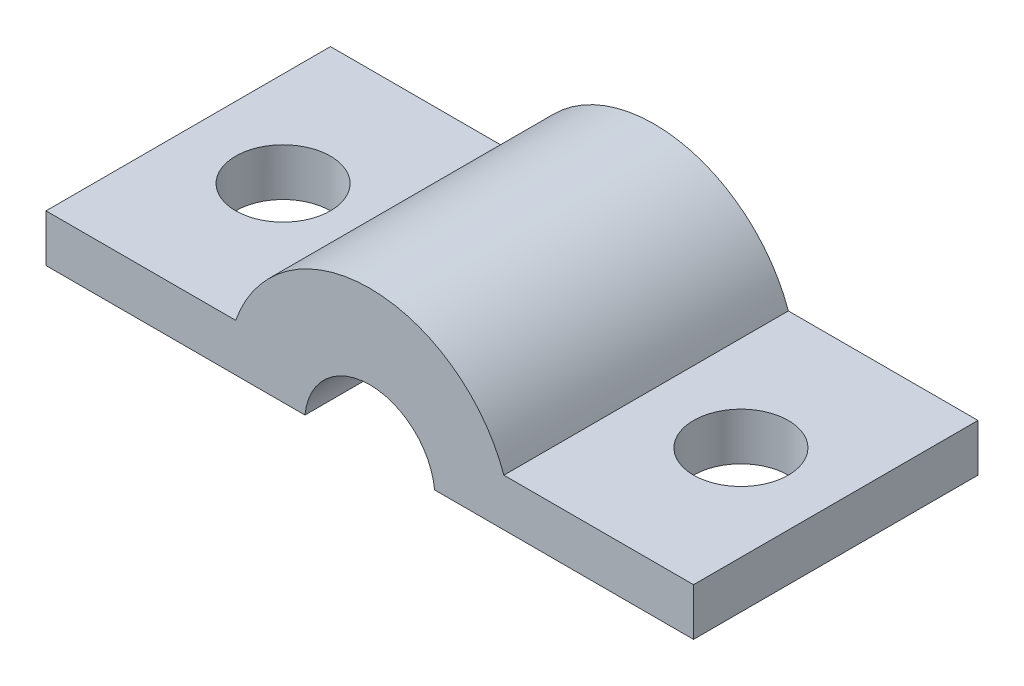
ISO-10303-21;
HEADER;
FILE_DESCRIPTION(('STEP AP214'),'2;1');
FILE_NAME('part.step','',(''),(''),'','','');
FILE_SCHEMA(('AUTOMOTIVE_DESIGN { 1 0 10303 214 1 1 1 1 }'));
ENDSEC;
DATA;
#1=APPLICATION_CONTEXT('core data for automotive mechanical design processes');
#2=APPLICATION_PROTOCOL_DEFINITION('international standard','automotive_design',2000,#1);
#3=PRODUCT_CONTEXT('',#1,'mechanical');
#4=PRODUCT('Part','Part','',(#3));
#5=PRODUCT_RELATED_PRODUCT_CATEGORY('part','',(#4));
#6=PRODUCT_DEFINITION_FORMATION('','',#4);
#7=PRODUCT_DEFINITION_CONTEXT('part definition',#1,'design');
#8=PRODUCT_DEFINITION('design','',#6,#7);
#9=PRODUCT_DEFINITION_SHAPE('','',#8);
#10=(LENGTH_UNIT() NAMED_UNIT(*) SI_UNIT(.MILLI.,.METRE.));
#11=(NAMED_UNIT(*) PLANE_ANGLE_UNIT() SI_UNIT($,.RADIAN.));
#12=(NAMED_UNIT(*) SI_UNIT($,.STERADIAN.) SOLID_ANGLE_UNIT());
#13=UNCERTAINTY_MEASURE_WITH_UNIT(LENGTH_MEASURE(1.E-05),#10,'distance_accuracy_value','');
#14=(GEOMETRIC_REPRESENTATION_CONTEXT(3) GLOBAL_UNCERTAINTY_ASSIGNED_CONTEXT((#13)) GLOBAL_UNIT_ASSIGNED_CONTEXT((#10,
#11,#12)) REPRESENTATION_CONTEXT('',''));
#15=CARTESIAN_POINT('',(0.,0.,0.));
#16=DIRECTION('',(0.,0.,1.));
#17=DIRECTION('',(1.,0.,0.));
#18=AXIS2_PLACEMENT_3D('',#15,#16,#17);
#19=CARTESIAN_POINT('',(0.,0.,9.));
#20=DIRECTION('',(0.,0.,-1.));
#21=DIRECTION('',(-1.,0.,0.));
#22=AXIS2_PLACEMENT_3D('',#19,#20,#21);
#23=CYLINDRICAL_SURFACE('',#22,4.5);
#24=CARTESIAN_POINT('',(0.,0.,0.));
#25=DIRECTION('',(0.,0.,1.));
#26=DIRECTION('',(1.,0.,0.));
#27=AXIS2_PLACEMENT_3D('',#24,#25,#26);
#28=CIRCLE('',#27,4.5);
#29=CARTESIAN_POINT('',(4.24264068711928,1.5,0.));
#30=VERTEX_POINT('',#29);
#31=CARTESIAN_POINT('',(-4.24264068711928,1.5,0.));
#32=VERTEX_POINT('',#31);
#33=EDGE_CURVE('E136',#30,#32,#28,.T.);
#34=ORIENTED_EDGE('',*,*,#33,.T.);
#35=DIRECTION('',(0.,0.,-1.));
#36=VECTOR('',#35,1.);
#37=CARTESIAN_POINT('',(-4.24264068711928,1.5,9.));
#38=LINE('',#37,#36);
#39=CARTESIAN_POINT('',(-4.24264068711928,1.5,9.));
#40=VERTEX_POINT('',#39);
#41=EDGE_CURVE('E11',#40,#32,#38,.T.);
#42=ORIENTED_EDGE('',*,*,#41,.F.);
#43=CARTESIAN_POINT('',(0.,0.,9.));
#44=DIRECTION('',(0.,0.,1.));
#45=DIRECTION('',(1.,0.,0.));
#46=AXIS2_PLACEMENT_3D('',#43,#44,#45);
#47=CIRCLE('',#46,4.5);
#48=CARTESIAN_POINT('',(4.24264068711928,1.5,9.));
#49=VERTEX_POINT('',#48);
#50=EDGE_CURVE('E147',#49,#40,#47,.T.);
#51=ORIENTED_EDGE('',*,*,#50,.F.);
#52=DIRECTION('',(0.,0.,-1.));
#53=VECTOR('',#52,1.);
#54=CARTESIAN_POINT('',(4.24264068711928,1.5,9.));
#55=LINE('',#54,#53);
#56=EDGE_CURVE('E135',#49,#30,#55,.T.);
#57=ORIENTED_EDGE('',*,*,#56,.T.);
#58=EDGE_LOOP('',(#34,#42,#51,#57));
#59=FACE_BOUND('',#58,.T.);
#60=ADVANCED_FACE('F39',(#59),#23,.T.);
#61=CARTESIAN_POINT('',(-10.2426406871193,1.5,9.));
#62=DIRECTION('',(0.,-1.,0.));
#63=DIRECTION('',(0.,0.,-1.));
#64=AXIS2_PLACEMENT_3D('',#61,#62,#63);
#65=PLANE('',#64);
#66=CARTESIAN_POINT('',(-7.24264068711929,1.5,4.5));
#67=DIRECTION('',(0.,1.,0.));
#68=DIRECTION('',(0.,0.,1.));
#69=AXIS2_PLACEMENT_3D('',#66,#67,#68);
#70=CIRCLE('',#69,1.5);
#71=CARTESIAN_POINT('',(-7.24264068711929,1.5,6.));
#72=VERTEX_POINT('',#71);
#73=EDGE_CURVE('E190',#72,#72,#70,.T.);
#74=ORIENTED_EDGE('',*,*,#73,.F.);
#75=EDGE_LOOP('',(#74));
#76=FACE_BOUND('',#75,.T.);
#77=DIRECTION('',(-1.,0.,0.));
#78=VECTOR('',#77,1.);
#79=CARTESIAN_POINT('',(-10.2426406871193,1.5,0.));
#80=LINE('',#79,#78);
#81=CARTESIAN_POINT('',(-10.2426406871193,1.5,0.));
#82=VERTEX_POINT('',#81);
#83=EDGE_CURVE('E138',#32,#82,#80,.T.);
#84=ORIENTED_EDGE('',*,*,#83,.T.);
#85=DIRECTION('',(0.,0.,-1.));
#86=VECTOR('',#85,1.);
#87=CARTESIAN_POINT('',(-10.2426406871193,1.5,9.));
#88=LINE('',#87,#86);
#89=CARTESIAN_POINT('',(-10.2426406871193,1.5,9.));
#90=VERTEX_POINT('',#89);
#91=EDGE_CURVE('E48',#90,#82,#88,.T.);
#92=ORIENTED_EDGE('',*,*,#91,.F.);
#93=DIRECTION('',(-1.,0.,0.));
#94=VECTOR('',#93,1.);
#95=CARTESIAN_POINT('',(-10.2426406871193,1.5,9.));
#96=LINE('',#95,#94);
#97=EDGE_CURVE('E97',#40,#90,#96,.T.);
#98=ORIENTED_EDGE('',*,*,#97,.F.);
#99=ORIENTED_EDGE('',*,*,#41,.T.);
#100=EDGE_LOOP('',(#84,#92,#98,#99));
#101=FACE_BOUND('',#100,.T.);
#102=ADVANCED_FACE('F197',(#76,#101),#65,.F.);
#103=CARTESIAN_POINT('',(-10.2426406871193,0.,9.));
#104=DIRECTION('',(1.,0.,0.));
#105=DIRECTION('',(0.,0.,-1.));
#106=AXIS2_PLACEMENT_3D('',#103,#104,#105);
#107=PLANE('',#106);
#108=DIRECTION('',(0.,-1.,0.));
#109=VECTOR('',#108,1.);
#110=CARTESIAN_POINT('',(-10.2426406871193,0.,0.));
#111=LINE('',#110,#109);
#112=CARTESIAN_POINT('',(-10.2426406871193,0.,0.));
#113=VERTEX_POINT('',#112);
#114=EDGE_CURVE('E143',#82,#113,#111,.T.);
#115=ORIENTED_EDGE('',*,*,#114,.T.);
#116=DIRECTION('',(0.,0.,-1.));
#117=VECTOR('',#116,1.);
#118=CARTESIAN_POINT('',(-10.2426406871193,0.,9.));
#119=LINE('',#118,#117);
#120=CARTESIAN_POINT('',(-10.2426406871193,0.,9.));
#121=VERTEX_POINT('',#120);
#122=EDGE_CURVE('E160',#121,#113,#119,.T.);
#123=ORIENTED_EDGE('',*,*,#122,.F.);
#124=DIRECTION('',(0.,-1.,0.));
#125=VECTOR('',#124,1.);
#126=CARTESIAN_POINT('',(-10.2426406871193,0.,9.));
#127=LINE('',#126,#125);
#128=EDGE_CURVE('E167',#90,#121,#127,.T.);
#129=ORIENTED_EDGE('',*,*,#128,.F.);
#130=ORIENTED_EDGE('',*,*,#91,.T.);
#131=EDGE_LOOP('',(#115,#123,#129,#130));
#132=FACE_BOUND('',#131,.T.);
#133=ADVANCED_FACE('F163',(#132),#107,.F.);
#134=CARTESIAN_POINT('',(-2.05,0.,9.));
#135=DIRECTION('',(0.,1.,0.));
#136=DIRECTION('',(-1.,0.,0.));
#137=AXIS2_PLACEMENT_3D('',#134,#135,#136);
#138=PLANE('',#137);
#139=CARTESIAN_POINT('',(-7.24264068711929,0.,4.5));
#140=DIRECTION('',(0.,1.,0.));
#141=DIRECTION('',(-1.,0.,0.));
#142=AXIS2_PLACEMENT_3D('',#139,#140,#141);
#143=CIRCLE('',#142,1.5);
#144=CARTESIAN_POINT('',(-8.74264068711929,0.,4.5));
#145=VERTEX_POINT('',#144);
#146=EDGE_CURVE('E45',#145,#145,#143,.T.);
#147=ORIENTED_EDGE('',*,*,#146,.T.);
#148=EDGE_LOOP('',(#147));
#149=FACE_BOUND('',#148,.T.);
#150=DIRECTION('',(1.,0.,0.));
#151=VECTOR('',#150,1.);
#152=CARTESIAN_POINT('',(-2.05,0.,0.));
#153=LINE('',#152,#151);
#154=CARTESIAN_POINT('',(-2.05,0.,0.));
#155=VERTEX_POINT('',#154);
#156=EDGE_CURVE('E141',#113,#155,#153,.T.);
#157=ORIENTED_EDGE('',*,*,#156,.T.);
#158=DIRECTION('',(0.,0.,-1.));
#159=VECTOR('',#158,1.);
#160=CARTESIAN_POINT('',(-2.05,0.,9.));
#161=LINE('',#160,#159);
#162=CARTESIAN_POINT('',(-2.05,0.,9.));
#163=VERTEX_POINT('',#162);
#164=EDGE_CURVE('E152',#163,#155,#161,.T.);
#165=ORIENTED_EDGE('',*,*,#164,.F.);
#166=DIRECTION('',(1.,0.,0.));
#167=VECTOR('',#166,1.);
#168=CARTESIAN_POINT('',(-2.05,0.,9.));
#169=LINE('',#168,#167);
#170=EDGE_CURVE('E177',#121,#163,#169,.T.);
#171=ORIENTED_EDGE('',*,*,#170,.F.);
#172=ORIENTED_EDGE('',*,*,#122,.T.);
#173=EDGE_LOOP('',(#157,#165,#171,#172));
#174=FACE_BOUND('',#173,.T.);
#175=ADVANCED_FACE('F173',(#149,#174),#138,.F.);
#176=CARTESIAN_POINT('',(0.,-0.202731349327138,9.));
#177=DIRECTION('',(0.,0.,-1.));
#178=DIRECTION('',(-1.,0.,0.));
#179=AXIS2_PLACEMENT_3D('',#176,#177,#178);
#180=CYLINDRICAL_SURFACE('',#179,2.06);
#181=CARTESIAN_POINT('',(0.,-0.202731349327138,0.));
#182=DIRECTION('',(0.,0.,-1.));
#183=DIRECTION('',(-1.,0.,0.));
#184=AXIS2_PLACEMENT_3D('',#181,#182,#183);
#185=CIRCLE('',#184,2.06);
#186=CARTESIAN_POINT('',(2.05,0.,0.));
#187=VERTEX_POINT('',#186);
#188=EDGE_CURVE('E144',#155,#187,#185,.T.);
#189=ORIENTED_EDGE('',*,*,#188,.T.);
#190=DIRECTION('',(0.,0.,-1.));
#191=VECTOR('',#190,1.);
#192=CARTESIAN_POINT('',(2.05,0.,9.));
#193=LINE('',#192,#191);
#194=CARTESIAN_POINT('',(2.05,0.,9.));
#195=VERTEX_POINT('',#194);
#196=EDGE_CURVE('E130',#195,#187,#193,.T.);
#197=ORIENTED_EDGE('',*,*,#196,.F.);
#198=CARTESIAN_POINT('',(0.,-0.202731349327138,9.));
#199=DIRECTION('',(0.,0.,-1.));
#200=DIRECTION('',(-1.,0.,0.));
#201=AXIS2_PLACEMENT_3D('',#198,#199,#200);
#202=CIRCLE('',#201,2.06);
#203=EDGE_CURVE('E117',#163,#195,#202,.T.);
#204=ORIENTED_EDGE('',*,*,#203,.F.);
#205=ORIENTED_EDGE('',*,*,#164,.T.);
#206=EDGE_LOOP('',(#189,#197,#204,#205));
#207=FACE_BOUND('',#206,.T.);
#208=ADVANCED_FACE('F180',(#207),#180,.F.);
#209=CARTESIAN_POINT('',(2.05,0.,9.));
#210=DIRECTION('',(0.,1.,0.));
#211=DIRECTION('',(0.,0.,1.));
#212=AXIS2_PLACEMENT_3D('',#209,#210,#211);
#213=PLANE('',#212);
#214=CARTESIAN_POINT('',(7.24264068711929,0.,4.5));
#215=DIRECTION('',(0.,1.,0.));
#216=DIRECTION('',(0.,0.,1.));
#217=AXIS2_PLACEMENT_3D('',#214,#215,#216);
#218=CIRCLE('',#217,1.5);
#219=CARTESIAN_POINT('',(7.24264068711929,0.,6.));
#220=VERTEX_POINT('',#219);
#221=EDGE_CURVE('E184',#220,#220,#218,.T.);
#222=ORIENTED_EDGE('',*,*,#221,.T.);
#223=EDGE_LOOP('',(#222));
#224=FACE_BOUND('',#223,.T.);
#225=DIRECTION('',(1.,0.,0.));
#226=VECTOR('',#225,1.);
#227=CARTESIAN_POINT('',(2.05,0.,0.));
#228=LINE('',#227,#226);
#229=CARTESIAN_POINT('',(10.2426406871193,0.,0.));
#230=VERTEX_POINT('',#229);
#231=EDGE_CURVE('E127',#187,#230,#228,.T.);
#232=ORIENTED_EDGE('',*,*,#231,.T.);
#233=DIRECTION('',(0.,0.,-1.));
#234=VECTOR('',#233,1.);
#235=CARTESIAN_POINT('',(10.2426406871193,0.,9.));
#236=LINE('',#235,#234);
#237=CARTESIAN_POINT('',(10.2426406871193,0.,9.));
#238=VERTEX_POINT('',#237);
#239=EDGE_CURVE('E122',#238,#230,#236,.T.);
#240=ORIENTED_EDGE('',*,*,#239,.F.);
#241=DIRECTION('',(1.,0.,0.));
#242=VECTOR('',#241,1.);
#243=CARTESIAN_POINT('',(2.05,0.,9.));
#244=LINE('',#243,#242);
#245=EDGE_CURVE('E115',#195,#238,#244,.T.);
#246=ORIENTED_EDGE('',*,*,#245,.F.);
#247=ORIENTED_EDGE('',*,*,#196,.T.);
#248=EDGE_LOOP('',(#232,#240,#246,#247));
#249=FACE_BOUND('',#248,.T.);
#250=ADVANCED_FACE('F123',(#224,#249),#213,.F.);
#251=CARTESIAN_POINT('',(10.2426406871193,0.,9.));
#252=DIRECTION('',(-1.,0.,0.));
#253=DIRECTION('',(0.,0.,1.));
#254=AXIS2_PLACEMENT_3D('',#251,#252,#253);
#255=PLANE('',#254);
#256=DIRECTION('',(0.,1.,0.));
#257=VECTOR('',#256,1.);
#258=CARTESIAN_POINT('',(10.2426406871193,0.,0.));
#259=LINE('',#258,#257);
#260=CARTESIAN_POINT('',(10.2426406871193,1.5,0.));
#261=VERTEX_POINT('',#260);
#262=EDGE_CURVE('E84',#230,#261,#259,.T.);
#263=ORIENTED_EDGE('',*,*,#262,.T.);
#264=DIRECTION('',(0.,0.,-1.));
#265=VECTOR('',#264,1.);
#266=CARTESIAN_POINT('',(10.2426406871193,1.5,9.));
#267=LINE('',#266,#265);
#268=CARTESIAN_POINT('',(10.2426406871193,1.5,9.));
#269=VERTEX_POINT('',#268);
#270=EDGE_CURVE('E126',#269,#261,#267,.T.);
#271=ORIENTED_EDGE('',*,*,#270,.F.);
#272=DIRECTION('',(0.,1.,0.));
#273=VECTOR('',#272,1.);
#274=CARTESIAN_POINT('',(10.2426406871193,0.,9.));
#275=LINE('',#274,#273);
#276=EDGE_CURVE('E116',#238,#269,#275,.T.);
#277=ORIENTED_EDGE('',*,*,#276,.F.);
#278=ORIENTED_EDGE('',*,*,#239,.T.);
#279=EDGE_LOOP('',(#263,#271,#277,#278));
#280=FACE_BOUND('',#279,.T.);
#281=ADVANCED_FACE('F128',(#280),#255,.F.);
#282=CARTESIAN_POINT('',(10.2426406871193,1.5,9.));
#283=DIRECTION('',(0.,-1.,0.));
#284=DIRECTION('',(0.,0.,-1.));
#285=AXIS2_PLACEMENT_3D('',#282,#283,#284);
#286=PLANE('',#285);
#287=CARTESIAN_POINT('',(7.24264068711929,1.5,4.5));
#288=DIRECTION('',(0.,1.,0.));
#289=DIRECTION('',(0.,0.,1.));
#290=AXIS2_PLACEMENT_3D('',#287,#288,#289);
#291=CIRCLE('',#290,1.5);
#292=CARTESIAN_POINT('',(7.24264068711929,1.5,6.));
#293=VERTEX_POINT('',#292);
#294=EDGE_CURVE('E187',#293,#293,#291,.T.);
#295=ORIENTED_EDGE('',*,*,#294,.F.);
#296=EDGE_LOOP('',(#295));
#297=FACE_BOUND('',#296,.T.);
#298=DIRECTION('',(-1.,0.,0.));
#299=VECTOR('',#298,1.);
#300=CARTESIAN_POINT('',(10.2426406871193,1.5,0.));
#301=LINE('',#300,#299);
#302=EDGE_CURVE('E93',#261,#30,#301,.T.);
#303=ORIENTED_EDGE('',*,*,#302,.T.);
#304=ORIENTED_EDGE('',*,*,#56,.F.);
#305=DIRECTION('',(-1.,0.,0.));
#306=VECTOR('',#305,1.);
#307=CARTESIAN_POINT('',(10.2426406871193,1.5,9.));
#308=LINE('',#307,#306);
#309=EDGE_CURVE('E57',#269,#49,#308,.T.);
#310=ORIENTED_EDGE('',*,*,#309,.F.);
#311=ORIENTED_EDGE('',*,*,#270,.T.);
#312=EDGE_LOOP('',(#303,#304,#310,#311));
#313=FACE_BOUND('',#312,.T.);
#314=ADVANCED_FACE('F205',(#297,#313),#286,.F.);
#315=CARTESIAN_POINT('',(0.,0.,9.));
#316=DIRECTION('',(0.,0.,1.));
#317=DIRECTION('',(1.,0.,0.));
#318=AXIS2_PLACEMENT_3D('',#315,#316,#317);
#319=PLANE('',#318);
#320=ORIENTED_EDGE('',*,*,#50,.T.);
#321=ORIENTED_EDGE('',*,*,#97,.T.);
#322=ORIENTED_EDGE('',*,*,#128,.T.);
#323=ORIENTED_EDGE('',*,*,#170,.T.);
#324=ORIENTED_EDGE('',*,*,#203,.T.);
#325=ORIENTED_EDGE('',*,*,#245,.T.);
#326=ORIENTED_EDGE('',*,*,#276,.T.);
#327=ORIENTED_EDGE('',*,*,#309,.T.);
#328=EDGE_LOOP('',(#320,#321,#322,#323,#324,#325,#326,#327));
#329=FACE_BOUND('',#328,.T.);
#330=ADVANCED_FACE('F111',(#329),#319,.T.);
#331=CARTESIAN_POINT('',(0.,0.,0.));
#332=DIRECTION('',(0.,0.,1.));
#333=DIRECTION('',(1.,0.,0.));
#334=AXIS2_PLACEMENT_3D('',#331,#332,#333);
#335=PLANE('',#334);
#336=ORIENTED_EDGE('',*,*,#33,.F.);
#337=ORIENTED_EDGE('',*,*,#302,.F.);
#338=ORIENTED_EDGE('',*,*,#262,.F.);
#339=ORIENTED_EDGE('',*,*,#231,.F.);
#340=ORIENTED_EDGE('',*,*,#188,.F.);
#341=ORIENTED_EDGE('',*,*,#156,.F.);
#342=ORIENTED_EDGE('',*,*,#114,.F.);
#343=ORIENTED_EDGE('',*,*,#83,.F.);
#344=EDGE_LOOP('',(#336,#337,#338,#339,#340,#341,#342,#343));
#345=FACE_BOUND('',#344,.T.);
#346=ADVANCED_FACE('F168',(#345),#335,.F.);
#347=CARTESIAN_POINT('',(7.24264068711929,-8.5,4.5));
#348=DIRECTION('',(0.,1.,0.));
#349=DIRECTION('',(0.,0.,1.));
#350=AXIS2_PLACEMENT_3D('',#347,#348,#349);
#351=CYLINDRICAL_SURFACE('',#350,1.5);
#352=ORIENTED_EDGE('',*,*,#294,.T.);
#353=EDGE_LOOP('',(#352));
#354=FACE_BOUND('',#353,.T.);
#355=ORIENTED_EDGE('',*,*,#221,.F.);
#356=EDGE_LOOP('',(#355));
#357=FACE_BOUND('',#356,.T.);
#358=ADVANCED_FACE('F252',(#354,#357),#351,.F.);
#359=CARTESIAN_POINT('',(-7.24264068711929,-8.5,4.5));
#360=DIRECTION('',(0.,1.,0.));
#361=DIRECTION('',(0.,0.,1.));
#362=AXIS2_PLACEMENT_3D('',#359,#360,#361);
#363=CYLINDRICAL_SURFACE('',#362,1.5);
#364=ORIENTED_EDGE('',*,*,#73,.T.);
#365=EDGE_LOOP('',(#364));
#366=FACE_BOUND('',#365,.T.);
#367=ORIENTED_EDGE('',*,*,#146,.F.);
#368=EDGE_LOOP('',(#367));
#369=FACE_BOUND('',#368,.T.);
#370=ADVANCED_FACE('F193',(#366,#369),#363,.F.);
#371=CLOSED_SHELL('',(#60,#102,#133,#175,#208,#250,#281,#314,#330,#346,#358,#370));
#372=MANIFOLD_SOLID_BREP('B2',#371);
#373=ADVANCED_BREP_SHAPE_REPRESENTATION('',(#18,#372),#14);
#374=SHAPE_DEFINITION_REPRESENTATION(#9,#373);
ENDSEC;
END-ISO-10303-21;
